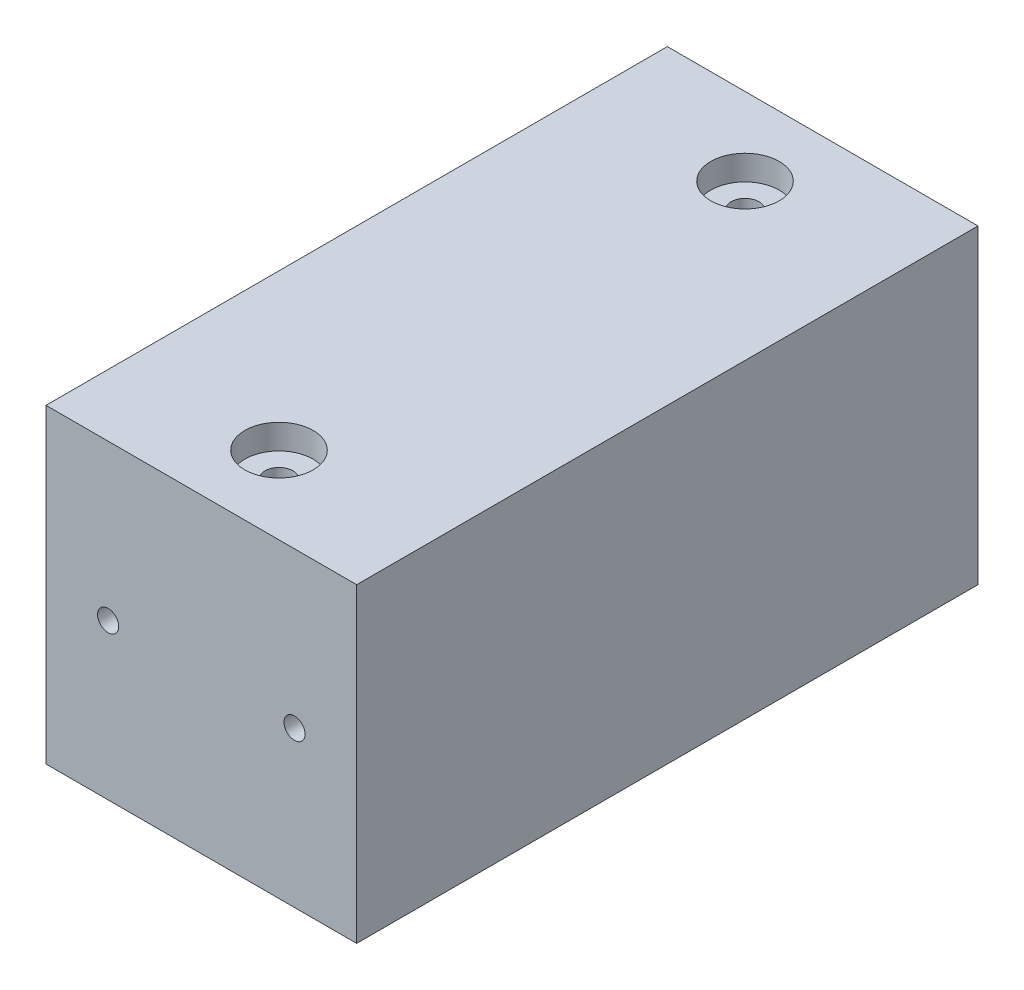
ISO-10303-21;
HEADER;
FILE_DESCRIPTION(('STEP AP214'),'2;1');
FILE_NAME('part.step','',(''),(''),'','','');
FILE_SCHEMA(('AUTOMOTIVE_DESIGN { 1 0 10303 214 1 1 1 1 }'));
ENDSEC;
DATA;
#1=APPLICATION_CONTEXT('core data for automotive mechanical design processes');
#2=APPLICATION_PROTOCOL_DEFINITION('international standard','automotive_design',2000,#1);
#3=PRODUCT_CONTEXT('',#1,'mechanical');
#4=PRODUCT('Part','Part','',(#3));
#5=PRODUCT_RELATED_PRODUCT_CATEGORY('part','',(#4));
#6=PRODUCT_DEFINITION_FORMATION('','',#4);
#7=PRODUCT_DEFINITION_CONTEXT('part definition',#1,'design');
#8=PRODUCT_DEFINITION('design','',#6,#7);
#9=PRODUCT_DEFINITION_SHAPE('','',#8);
#10=(LENGTH_UNIT() NAMED_UNIT(*) SI_UNIT(.MILLI.,.METRE.));
#11=(NAMED_UNIT(*) PLANE_ANGLE_UNIT() SI_UNIT($,.RADIAN.));
#12=(NAMED_UNIT(*) SI_UNIT($,.STERADIAN.) SOLID_ANGLE_UNIT());
#13=UNCERTAINTY_MEASURE_WITH_UNIT(LENGTH_MEASURE(1.E-05),#10,'distance_accuracy_value','');
#14=(GEOMETRIC_REPRESENTATION_CONTEXT(3) GLOBAL_UNCERTAINTY_ASSIGNED_CONTEXT((#13)) GLOBAL_UNIT_ASSIGNED_CONTEXT((#10,
#11,#12)) REPRESENTATION_CONTEXT('',''));
#15=CARTESIAN_POINT('',(0.,0.,0.));
#16=DIRECTION('',(0.,0.,1.));
#17=DIRECTION('',(1.,0.,0.));
#18=AXIS2_PLACEMENT_3D('',#15,#16,#17);
#19=CARTESIAN_POINT('',(-50.,-50.,200.));
#20=DIRECTION('',(1.,0.,0.));
#21=DIRECTION('',(0.,1.,0.));
#22=AXIS2_PLACEMENT_3D('',#19,#20,#21);
#23=PLANE('',#22);
#24=DIRECTION('',(0.,-1.,0.));
#25=VECTOR('',#24,1.);
#26=CARTESIAN_POINT('',(-50.,-50.,0.));
#27=LINE('',#26,#25);
#28=CARTESIAN_POINT('',(-50.,50.,0.));
#29=VERTEX_POINT('',#28);
#30=CARTESIAN_POINT('',(-50.,-50.,0.));
#31=VERTEX_POINT('',#30);
#32=EDGE_CURVE('E162',#29,#31,#27,.T.);
#33=ORIENTED_EDGE('',*,*,#32,.T.);
#34=DIRECTION('',(0.,0.,-1.));
#35=VECTOR('',#34,1.);
#36=CARTESIAN_POINT('',(-50.,-50.,200.));
#37=LINE('',#36,#35);
#38=CARTESIAN_POINT('',(-50.,-50.,200.));
#39=VERTEX_POINT('',#38);
#40=EDGE_CURVE('E13',#39,#31,#37,.T.);
#41=ORIENTED_EDGE('',*,*,#40,.F.);
#42=DIRECTION('',(0.,-1.,0.));
#43=VECTOR('',#42,1.);
#44=CARTESIAN_POINT('',(-50.,-50.,200.));
#45=LINE('',#44,#43);
#46=CARTESIAN_POINT('',(-50.,50.,200.));
#47=VERTEX_POINT('',#46);
#48=EDGE_CURVE('E163',#47,#39,#45,.T.);
#49=ORIENTED_EDGE('',*,*,#48,.F.);
#50=DIRECTION('',(0.,0.,-1.));
#51=VECTOR('',#50,1.);
#52=CARTESIAN_POINT('',(-50.,50.,200.));
#53=LINE('',#52,#51);
#54=EDGE_CURVE('E169',#47,#29,#53,.T.);
#55=ORIENTED_EDGE('',*,*,#54,.T.);
#56=EDGE_LOOP('',(#33,#41,#49,#55));
#57=FACE_BOUND('',#56,.T.);
#58=ADVANCED_FACE('F49',(#57),#23,.F.);
#59=CARTESIAN_POINT('',(50.,-50.,200.));
#60=DIRECTION('',(0.,1.,0.));
#61=DIRECTION('',(-1.,0.,0.));
#62=AXIS2_PLACEMENT_3D('',#59,#60,#61);
#63=PLANE('',#62);
#64=CARTESIAN_POINT('',(0.,-50.,175.));
#65=DIRECTION('',(0.,-1.,0.));
#66=DIRECTION('',(0.,0.,-1.));
#67=AXIS2_PLACEMENT_3D('',#64,#65,#66);
#68=CIRCLE('',#67,7.5);
#69=CARTESIAN_POINT('',(0.,-50.,167.5));
#70=VERTEX_POINT('',#69);
#71=EDGE_CURVE('E212',#70,#70,#68,.T.);
#72=ORIENTED_EDGE('',*,*,#71,.F.);
#73=EDGE_LOOP('',(#72));
#74=FACE_BOUND('',#73,.T.);
#75=CARTESIAN_POINT('',(0.,-50.,25.));
#76=DIRECTION('',(0.,-1.,0.));
#77=DIRECTION('',(0.,0.,-1.));
#78=AXIS2_PLACEMENT_3D('',#75,#76,#77);
#79=CIRCLE('',#78,7.5);
#80=CARTESIAN_POINT('',(0.,-50.,17.5));
#81=VERTEX_POINT('',#80);
#82=EDGE_CURVE('E215',#81,#81,#79,.T.);
#83=ORIENTED_EDGE('',*,*,#82,.F.);
#84=EDGE_LOOP('',(#83));
#85=FACE_BOUND('',#84,.T.);
#86=DIRECTION('',(1.,0.,0.));
#87=VECTOR('',#86,1.);
#88=CARTESIAN_POINT('',(50.,-50.,0.));
#89=LINE('',#88,#87);
#90=CARTESIAN_POINT('',(50.,-50.,0.));
#91=VERTEX_POINT('',#90);
#92=EDGE_CURVE('E172',#31,#91,#89,.T.);
#93=ORIENTED_EDGE('',*,*,#92,.T.);
#94=DIRECTION('',(0.,0.,-1.));
#95=VECTOR('',#94,1.);
#96=CARTESIAN_POINT('',(50.,-50.,200.));
#97=LINE('',#96,#95);
#98=CARTESIAN_POINT('',(50.,-50.,200.));
#99=VERTEX_POINT('',#98);
#100=EDGE_CURVE('E57',#99,#91,#97,.T.);
#101=ORIENTED_EDGE('',*,*,#100,.F.);
#102=DIRECTION('',(1.,0.,0.));
#103=VECTOR('',#102,1.);
#104=CARTESIAN_POINT('',(50.,-50.,200.));
#105=LINE('',#104,#103);
#106=EDGE_CURVE('E96',#39,#99,#105,.T.);
#107=ORIENTED_EDGE('',*,*,#106,.F.);
#108=ORIENTED_EDGE('',*,*,#40,.T.);
#109=EDGE_LOOP('',(#93,#101,#107,#108));
#110=FACE_BOUND('',#109,.T.);
#111=ADVANCED_FACE('F197',(#74,#85,#110),#63,.F.);
#112=CARTESIAN_POINT('',(50.,-50.,200.));
#113=DIRECTION('',(-1.,0.,0.));
#114=DIRECTION('',(0.,-1.,0.));
#115=AXIS2_PLACEMENT_3D('',#112,#113,#114);
#116=PLANE('',#115);
#117=DIRECTION('',(0.,1.,0.));
#118=VECTOR('',#117,1.);
#119=CARTESIAN_POINT('',(50.,-50.,0.));
#120=LINE('',#119,#118);
#121=CARTESIAN_POINT('',(50.,50.,0.));
#122=VERTEX_POINT('',#121);
#123=EDGE_CURVE('E83',#91,#122,#120,.T.);
#124=ORIENTED_EDGE('',*,*,#123,.T.);
#125=DIRECTION('',(0.,0.,-1.));
#126=VECTOR('',#125,1.);
#127=CARTESIAN_POINT('',(50.,50.,200.));
#128=LINE('',#127,#126);
#129=CARTESIAN_POINT('',(50.,50.,200.));
#130=VERTEX_POINT('',#129);
#131=EDGE_CURVE('E177',#130,#122,#128,.T.);
#132=ORIENTED_EDGE('',*,*,#131,.F.);
#133=DIRECTION('',(0.,1.,0.));
#134=VECTOR('',#133,1.);
#135=CARTESIAN_POINT('',(50.,-50.,200.));
#136=LINE('',#135,#134);
#137=EDGE_CURVE('E166',#99,#130,#136,.T.);
#138=ORIENTED_EDGE('',*,*,#137,.F.);
#139=ORIENTED_EDGE('',*,*,#100,.T.);
#140=EDGE_LOOP('',(#124,#132,#138,#139));
#141=FACE_BOUND('',#140,.T.);
#142=ADVANCED_FACE('F179',(#141),#116,.F.);
#143=CARTESIAN_POINT('',(50.,50.,200.));
#144=DIRECTION('',(0.,-1.,0.));
#145=DIRECTION('',(1.,0.,0.));
#146=AXIS2_PLACEMENT_3D('',#143,#144,#145);
#147=PLANE('',#146);
#148=CARTESIAN_POINT('',(0.,50.,25.));
#149=DIRECTION('',(0.,1.,0.));
#150=DIRECTION('',(0.,0.,1.));
#151=AXIS2_PLACEMENT_3D('',#148,#149,#150);
#152=CIRCLE('',#151,11.);
#153=CARTESIAN_POINT('',(0.,50.,36.));
#154=VERTEX_POINT('',#153);
#155=EDGE_CURVE('E144',#154,#154,#152,.T.);
#156=ORIENTED_EDGE('',*,*,#155,.F.);
#157=EDGE_LOOP('',(#156));
#158=FACE_BOUND('',#157,.T.);
#159=CARTESIAN_POINT('',(0.,50.,175.));
#160=DIRECTION('',(0.,1.,0.));
#161=DIRECTION('',(0.,0.,1.));
#162=AXIS2_PLACEMENT_3D('',#159,#160,#161);
#163=CIRCLE('',#162,11.);
#164=CARTESIAN_POINT('',(0.,50.,186.));
#165=VERTEX_POINT('',#164);
#166=EDGE_CURVE('E153',#165,#165,#163,.T.);
#167=ORIENTED_EDGE('',*,*,#166,.F.);
#168=EDGE_LOOP('',(#167));
#169=FACE_BOUND('',#168,.T.);
#170=DIRECTION('',(-1.,0.,0.));
#171=VECTOR('',#170,1.);
#172=CARTESIAN_POINT('',(50.,50.,0.));
#173=LINE('',#172,#171);
#174=EDGE_CURVE('E89',#122,#29,#173,.T.);
#175=ORIENTED_EDGE('',*,*,#174,.T.);
#176=ORIENTED_EDGE('',*,*,#54,.F.);
#177=DIRECTION('',(-1.,0.,0.));
#178=VECTOR('',#177,1.);
#179=CARTESIAN_POINT('',(50.,50.,200.));
#180=LINE('',#179,#178);
#181=EDGE_CURVE('E65',#130,#47,#180,.T.);
#182=ORIENTED_EDGE('',*,*,#181,.F.);
#183=ORIENTED_EDGE('',*,*,#131,.T.);
#184=EDGE_LOOP('',(#175,#176,#182,#183));
#185=FACE_BOUND('',#184,.T.);
#186=ADVANCED_FACE('F186',(#158,#169,#185),#147,.F.);
#187=CARTESIAN_POINT('',(0.,0.,200.));
#188=DIRECTION('',(0.,0.,1.));
#189=DIRECTION('',(1.,0.,0.));
#190=AXIS2_PLACEMENT_3D('',#187,#188,#189);
#191=PLANE('',#190);
#192=CARTESIAN_POINT('',(30.,0.,200.));
#193=DIRECTION('',(0.,0.,1.));
#194=DIRECTION('',(1.,0.,0.));
#195=AXIS2_PLACEMENT_3D('',#192,#193,#194);
#196=CIRCLE('',#195,3.4);
#197=CARTESIAN_POINT('',(33.4,0.,200.));
#198=VERTEX_POINT('',#197);
#199=EDGE_CURVE('E120',#198,#198,#196,.T.);
#200=ORIENTED_EDGE('',*,*,#199,.F.);
#201=EDGE_LOOP('',(#200));
#202=FACE_BOUND('',#201,.T.);
#203=CARTESIAN_POINT('',(-30.,0.,200.));
#204=DIRECTION('',(0.,0.,1.));
#205=DIRECTION('',(1.,0.,0.));
#206=AXIS2_PLACEMENT_3D('',#203,#204,#205);
#207=CIRCLE('',#206,3.4);
#208=CARTESIAN_POINT('',(-26.6,0.,200.));
#209=VERTEX_POINT('',#208);
#210=EDGE_CURVE('E119',#209,#209,#207,.T.);
#211=ORIENTED_EDGE('',*,*,#210,.F.);
#212=EDGE_LOOP('',(#211));
#213=FACE_BOUND('',#212,.T.);
#214=ORIENTED_EDGE('',*,*,#48,.T.);
#215=ORIENTED_EDGE('',*,*,#106,.T.);
#216=ORIENTED_EDGE('',*,*,#137,.T.);
#217=ORIENTED_EDGE('',*,*,#181,.T.);
#218=EDGE_LOOP('',(#214,#215,#216,#217));
#219=FACE_BOUND('',#218,.T.);
#220=ADVANCED_FACE('F188',(#202,#213,#219),#191,.T.);
#221=CARTESIAN_POINT('',(0.,0.,0.));
#222=DIRECTION('',(0.,0.,1.));
#223=DIRECTION('',(1.,0.,0.));
#224=AXIS2_PLACEMENT_3D('',#221,#222,#223);
#225=PLANE('',#224);
#226=CARTESIAN_POINT('',(-30.,0.,0.));
#227=DIRECTION('',(0.,0.,-1.));
#228=DIRECTION('',(-1.,0.,0.));
#229=AXIS2_PLACEMENT_3D('',#226,#227,#228);
#230=CIRCLE('',#229,3.4);
#231=CARTESIAN_POINT('',(-33.4,0.,0.));
#232=VERTEX_POINT('',#231);
#233=EDGE_CURVE('E132',#232,#232,#230,.T.);
#234=ORIENTED_EDGE('',*,*,#233,.F.);
#235=EDGE_LOOP('',(#234));
#236=FACE_BOUND('',#235,.T.);
#237=CARTESIAN_POINT('',(30.,0.,0.));
#238=DIRECTION('',(0.,0.,-1.));
#239=DIRECTION('',(-1.,0.,0.));
#240=AXIS2_PLACEMENT_3D('',#237,#238,#239);
#241=CIRCLE('',#240,3.4);
#242=CARTESIAN_POINT('',(26.6,0.,0.));
#243=VERTEX_POINT('',#242);
#244=EDGE_CURVE('E138',#243,#243,#241,.T.);
#245=ORIENTED_EDGE('',*,*,#244,.F.);
#246=EDGE_LOOP('',(#245));
#247=FACE_BOUND('',#246,.T.);
#248=ORIENTED_EDGE('',*,*,#32,.F.);
#249=ORIENTED_EDGE('',*,*,#174,.F.);
#250=ORIENTED_EDGE('',*,*,#123,.F.);
#251=ORIENTED_EDGE('',*,*,#92,.F.);
#252=EDGE_LOOP('',(#248,#249,#250,#251));
#253=FACE_BOUND('',#252,.T.);
#254=ADVANCED_FACE('F182',(#236,#247,#253),#225,.F.);
#255=CARTESIAN_POINT('',(0.,50.,175.));
#256=DIRECTION('',(0.,1.,0.));
#257=DIRECTION('',(0.,0.,1.));
#258=AXIS2_PLACEMENT_3D('',#255,#256,#257);
#259=CYLINDRICAL_SURFACE('',#258,4.49999999999999);
#260=CARTESIAN_POINT('',(0.,-42.,175.));
#261=DIRECTION('',(0.,-1.,0.));
#262=DIRECTION('',(0.,0.,-1.));
#263=AXIS2_PLACEMENT_3D('',#260,#261,#262);
#264=CIRCLE('',#263,4.50000000000001);
#265=CARTESIAN_POINT('',(0.,-42.,170.5));
#266=VERTEX_POINT('',#265);
#267=EDGE_CURVE('E218',#266,#266,#264,.T.);
#268=ORIENTED_EDGE('',*,*,#267,.T.);
#269=EDGE_LOOP('',(#268));
#270=FACE_BOUND('',#269,.T.);
#271=CARTESIAN_POINT('',(0.,42.,175.));
#272=DIRECTION('',(0.,1.,0.));
#273=DIRECTION('',(0.,0.,1.));
#274=AXIS2_PLACEMENT_3D('',#271,#272,#273);
#275=CIRCLE('',#274,4.50000000000001);
#276=CARTESIAN_POINT('',(0.,42.,179.5));
#277=VERTEX_POINT('',#276);
#278=EDGE_CURVE('E159',#277,#277,#275,.T.);
#279=ORIENTED_EDGE('',*,*,#278,.T.);
#280=EDGE_LOOP('',(#279));
#281=FACE_BOUND('',#280,.T.);
#282=ADVANCED_FACE('F292',(#270,#281),#259,.F.);
#283=CARTESIAN_POINT('',(4.50000000000001,42.,175.));
#284=DIRECTION('',(0.,-1.,0.));
#285=DIRECTION('',(0.,0.,-1.));
#286=AXIS2_PLACEMENT_3D('',#283,#284,#285);
#287=PLANE('',#286);
#288=ORIENTED_EDGE('',*,*,#278,.F.);
#289=EDGE_LOOP('',(#288));
#290=FACE_BOUND('',#289,.T.);
#291=CARTESIAN_POINT('',(0.,42.,175.));
#292=DIRECTION('',(0.,1.,0.));
#293=DIRECTION('',(0.,0.,1.));
#294=AXIS2_PLACEMENT_3D('',#291,#292,#293);
#295=CIRCLE('',#294,11.);
#296=CARTESIAN_POINT('',(0.,42.,186.));
#297=VERTEX_POINT('',#296);
#298=EDGE_CURVE('E156',#297,#297,#295,.T.);
#299=ORIENTED_EDGE('',*,*,#298,.T.);
#300=EDGE_LOOP('',(#299));
#301=FACE_BOUND('',#300,.T.);
#302=ADVANCED_FACE('F288',(#290,#301),#287,.F.);
#303=CARTESIAN_POINT('',(0.,50.,175.));
#304=DIRECTION('',(0.,1.,0.));
#305=DIRECTION('',(0.,0.,1.));
#306=AXIS2_PLACEMENT_3D('',#303,#304,#305);
#307=CYLINDRICAL_SURFACE('',#306,11.);
#308=ORIENTED_EDGE('',*,*,#298,.F.);
#309=EDGE_LOOP('',(#308));
#310=FACE_BOUND('',#309,.T.);
#311=ORIENTED_EDGE('',*,*,#166,.T.);
#312=EDGE_LOOP('',(#311));
#313=FACE_BOUND('',#312,.T.);
#314=ADVANCED_FACE('F285',(#310,#313),#307,.F.);
#315=CARTESIAN_POINT('',(0.,50.,25.));
#316=DIRECTION('',(0.,1.,0.));
#317=DIRECTION('',(0.,0.,1.));
#318=AXIS2_PLACEMENT_3D('',#315,#316,#317);
#319=CYLINDRICAL_SURFACE('',#318,4.49999999999999);
#320=CARTESIAN_POINT('',(0.,-42.,25.));
#321=DIRECTION('',(0.,-1.,0.));
#322=DIRECTION('',(0.,0.,-1.));
#323=AXIS2_PLACEMENT_3D('',#320,#321,#322);
#324=CIRCLE('',#323,4.50000000000001);
#325=CARTESIAN_POINT('',(0.,-42.,20.5));
#326=VERTEX_POINT('',#325);
#327=EDGE_CURVE('E126',#326,#326,#324,.T.);
#328=ORIENTED_EDGE('',*,*,#327,.T.);
#329=EDGE_LOOP('',(#328));
#330=FACE_BOUND('',#329,.T.);
#331=CARTESIAN_POINT('',(0.,42.,25.));
#332=DIRECTION('',(0.,1.,0.));
#333=DIRECTION('',(0.,0.,1.));
#334=AXIS2_PLACEMENT_3D('',#331,#332,#333);
#335=CIRCLE('',#334,4.50000000000001);
#336=CARTESIAN_POINT('',(0.,42.,29.5));
#337=VERTEX_POINT('',#336);
#338=EDGE_CURVE('E150',#337,#337,#335,.T.);
#339=ORIENTED_EDGE('',*,*,#338,.T.);
#340=EDGE_LOOP('',(#339));
#341=FACE_BOUND('',#340,.T.);
#342=ADVANCED_FACE('F229',(#330,#341),#319,.F.);
#343=CARTESIAN_POINT('',(4.50000000000001,42.,25.));
#344=DIRECTION('',(0.,-1.,0.));
#345=DIRECTION('',(0.,0.,-1.));
#346=AXIS2_PLACEMENT_3D('',#343,#344,#345);
#347=PLANE('',#346);
#348=ORIENTED_EDGE('',*,*,#338,.F.);
#349=EDGE_LOOP('',(#348));
#350=FACE_BOUND('',#349,.T.);
#351=CARTESIAN_POINT('',(0.,42.,25.));
#352=DIRECTION('',(0.,1.,0.));
#353=DIRECTION('',(0.,0.,1.));
#354=AXIS2_PLACEMENT_3D('',#351,#352,#353);
#355=CIRCLE('',#354,11.);
#356=CARTESIAN_POINT('',(0.,42.,36.));
#357=VERTEX_POINT('',#356);
#358=EDGE_CURVE('E147',#357,#357,#355,.T.);
#359=ORIENTED_EDGE('',*,*,#358,.T.);
#360=EDGE_LOOP('',(#359));
#361=FACE_BOUND('',#360,.T.);
#362=ADVANCED_FACE('F278',(#350,#361),#347,.F.);
#363=CARTESIAN_POINT('',(0.,50.,25.));
#364=DIRECTION('',(0.,1.,0.));
#365=DIRECTION('',(0.,0.,1.));
#366=AXIS2_PLACEMENT_3D('',#363,#364,#365);
#367=CYLINDRICAL_SURFACE('',#366,11.);
#368=ORIENTED_EDGE('',*,*,#358,.F.);
#369=EDGE_LOOP('',(#368));
#370=FACE_BOUND('',#369,.T.);
#371=ORIENTED_EDGE('',*,*,#155,.T.);
#372=EDGE_LOOP('',(#371));
#373=FACE_BOUND('',#372,.T.);
#374=ADVANCED_FACE('F274',(#370,#373),#367,.F.);
#375=CARTESIAN_POINT('',(30.,0.,30.));
#376=DIRECTION('',(0.,0.,-1.));
#377=DIRECTION('',(-1.,0.,0.));
#378=AXIS2_PLACEMENT_3D('',#375,#376,#377);
#379=CONICAL_SURFACE('',#378,3.39999999999999,1.02974425867665);
#380=CARTESIAN_POINT('',(30.,0.,32.0429261046937));
#381=VERTEX_POINT('',#380);
#382=VERTEX_LOOP('',#381);
#383=FACE_BOUND('',#382,.T.);
#384=CARTESIAN_POINT('',(30.,0.,30.));
#385=DIRECTION('',(0.,0.,-1.));
#386=DIRECTION('',(-1.,0.,0.));
#387=AXIS2_PLACEMENT_3D('',#384,#385,#386);
#388=CIRCLE('',#387,3.39999999999999);
#389=CARTESIAN_POINT('',(26.6,0.,30.));
#390=VERTEX_POINT('',#389);
#391=EDGE_CURVE('E141',#390,#390,#388,.T.);
#392=ORIENTED_EDGE('',*,*,#391,.T.);
#393=EDGE_LOOP('',(#392));
#394=FACE_BOUND('',#393,.T.);
#395=ADVANCED_FACE('F270',(#383,#394),#379,.F.);
#396=CARTESIAN_POINT('',(30.,0.,0.));
#397=DIRECTION('',(0.,0.,-1.));
#398=DIRECTION('',(-1.,0.,0.));
#399=AXIS2_PLACEMENT_3D('',#396,#397,#398);
#400=CYLINDRICAL_SURFACE('',#399,3.4);
#401=ORIENTED_EDGE('',*,*,#391,.F.);
#402=EDGE_LOOP('',(#401));
#403=FACE_BOUND('',#402,.T.);
#404=ORIENTED_EDGE('',*,*,#244,.T.);
#405=EDGE_LOOP('',(#404));
#406=FACE_BOUND('',#405,.T.);
#407=ADVANCED_FACE('F266',(#403,#406),#400,.F.);
#408=CARTESIAN_POINT('',(-30.,0.,30.));
#409=DIRECTION('',(0.,0.,-1.));
#410=DIRECTION('',(-1.,0.,0.));
#411=AXIS2_PLACEMENT_3D('',#408,#409,#410);
#412=CONICAL_SURFACE('',#411,3.39999999999999,1.02974425867665);
#413=CARTESIAN_POINT('',(-30.,0.,32.0429261046937));
#414=VERTEX_POINT('',#413);
#415=VERTEX_LOOP('',#414);
#416=FACE_BOUND('',#415,.T.);
#417=CARTESIAN_POINT('',(-30.,0.,30.));
#418=DIRECTION('',(0.,0.,-1.));
#419=DIRECTION('',(-1.,0.,0.));
#420=AXIS2_PLACEMENT_3D('',#417,#418,#419);
#421=CIRCLE('',#420,3.39999999999999);
#422=CARTESIAN_POINT('',(-33.4,0.,30.));
#423=VERTEX_POINT('',#422);
#424=EDGE_CURVE('E135',#423,#423,#421,.T.);
#425=ORIENTED_EDGE('',*,*,#424,.T.);
#426=EDGE_LOOP('',(#425));
#427=FACE_BOUND('',#426,.T.);
#428=ADVANCED_FACE('F262',(#416,#427),#412,.F.);
#429=CARTESIAN_POINT('',(-30.,0.,0.));
#430=DIRECTION('',(0.,0.,-1.));
#431=DIRECTION('',(-1.,0.,0.));
#432=AXIS2_PLACEMENT_3D('',#429,#430,#431);
#433=CYLINDRICAL_SURFACE('',#432,3.4);
#434=ORIENTED_EDGE('',*,*,#424,.F.);
#435=EDGE_LOOP('',(#434));
#436=FACE_BOUND('',#435,.T.);
#437=ORIENTED_EDGE('',*,*,#233,.T.);
#438=EDGE_LOOP('',(#437));
#439=FACE_BOUND('',#438,.T.);
#440=ADVANCED_FACE('F258',(#436,#439),#433,.F.);
#441=CARTESIAN_POINT('',(-30.,0.,170.));
#442=DIRECTION('',(0.,0.,1.));
#443=DIRECTION('',(1.,0.,0.));
#444=AXIS2_PLACEMENT_3D('',#441,#442,#443);
#445=CONICAL_SURFACE('',#444,3.39999999999999,1.02974425867665);
#446=CARTESIAN_POINT('',(-30.,0.,167.957073895306));
#447=VERTEX_POINT('',#446);
#448=VERTEX_LOOP('',#447);
#449=FACE_BOUND('',#448,.T.);
#450=CARTESIAN_POINT('',(-30.,0.,170.));
#451=DIRECTION('',(0.,0.,1.));
#452=DIRECTION('',(1.,0.,0.));
#453=AXIS2_PLACEMENT_3D('',#450,#451,#452);
#454=CIRCLE('',#453,3.39999999999999);
#455=CARTESIAN_POINT('',(-26.6,0.,170.));
#456=VERTEX_POINT('',#455);
#457=EDGE_CURVE('E123',#456,#456,#454,.T.);
#458=ORIENTED_EDGE('',*,*,#457,.T.);
#459=EDGE_LOOP('',(#458));
#460=FACE_BOUND('',#459,.T.);
#461=ADVANCED_FACE('F254',(#449,#460),#445,.F.);
#462=CARTESIAN_POINT('',(-30.,0.,200.));
#463=DIRECTION('',(0.,0.,1.));
#464=DIRECTION('',(1.,0.,0.));
#465=AXIS2_PLACEMENT_3D('',#462,#463,#464);
#466=CYLINDRICAL_SURFACE('',#465,3.4);
#467=ORIENTED_EDGE('',*,*,#457,.F.);
#468=EDGE_LOOP('',(#467));
#469=FACE_BOUND('',#468,.T.);
#470=ORIENTED_EDGE('',*,*,#210,.T.);
#471=EDGE_LOOP('',(#470));
#472=FACE_BOUND('',#471,.T.);
#473=ADVANCED_FACE('F113',(#469,#472),#466,.F.);
#474=CARTESIAN_POINT('',(30.,0.,170.));
#475=DIRECTION('',(0.,0.,1.));
#476=DIRECTION('',(1.,0.,0.));
#477=AXIS2_PLACEMENT_3D('',#474,#475,#476);
#478=CONICAL_SURFACE('',#477,3.39999999999999,1.02974425867665);
#479=CARTESIAN_POINT('',(30.,0.,167.957073895306));
#480=VERTEX_POINT('',#479);
#481=VERTEX_LOOP('',#480);
#482=FACE_BOUND('',#481,.T.);
#483=CARTESIAN_POINT('',(30.,0.,170.));
#484=DIRECTION('',(0.,0.,1.));
#485=DIRECTION('',(1.,0.,0.));
#486=AXIS2_PLACEMENT_3D('',#483,#484,#485);
#487=CIRCLE('',#486,3.39999999999999);
#488=CARTESIAN_POINT('',(33.4,0.,170.));
#489=VERTEX_POINT('',#488);
#490=EDGE_CURVE('E117',#489,#489,#487,.T.);
#491=ORIENTED_EDGE('',*,*,#490,.T.);
#492=EDGE_LOOP('',(#491));
#493=FACE_BOUND('',#492,.T.);
#494=ADVANCED_FACE('F109',(#482,#493),#478,.F.);
#495=CARTESIAN_POINT('',(30.,0.,200.));
#496=DIRECTION('',(0.,0.,1.));
#497=DIRECTION('',(1.,0.,0.));
#498=AXIS2_PLACEMENT_3D('',#495,#496,#497);
#499=CYLINDRICAL_SURFACE('',#498,3.39999999999999);
#500=ORIENTED_EDGE('',*,*,#490,.F.);
#501=EDGE_LOOP('',(#500));
#502=FACE_BOUND('',#501,.T.);
#503=ORIENTED_EDGE('',*,*,#199,.T.);
#504=EDGE_LOOP('',(#503));
#505=FACE_BOUND('',#504,.T.);
#506=ADVANCED_FACE('F112',(#502,#505),#499,.F.);
#507=CARTESIAN_POINT('',(4.50000000000001,-42.,25.));
#508=DIRECTION('',(0.,1.,0.));
#509=DIRECTION('',(0.,0.,1.));
#510=AXIS2_PLACEMENT_3D('',#507,#508,#509);
#511=PLANE('',#510);
#512=ORIENTED_EDGE('',*,*,#327,.F.);
#513=EDGE_LOOP('',(#512));
#514=FACE_BOUND('',#513,.T.);
#515=CARTESIAN_POINT('',(0.,-42.,25.));
#516=DIRECTION('',(0.,-1.,0.));
#517=DIRECTION('',(0.,0.,-1.));
#518=AXIS2_PLACEMENT_3D('',#515,#516,#517);
#519=CIRCLE('',#518,7.5);
#520=CARTESIAN_POINT('',(0.,-42.,17.5));
#521=VERTEX_POINT('',#520);
#522=EDGE_CURVE('E217',#521,#521,#519,.T.);
#523=ORIENTED_EDGE('',*,*,#522,.T.);
#524=EDGE_LOOP('',(#523));
#525=FACE_BOUND('',#524,.T.);
#526=ADVANCED_FACE('F232',(#514,#525),#511,.F.);
#527=CARTESIAN_POINT('',(0.,-50.,25.));
#528=DIRECTION('',(0.,-1.,0.));
#529=DIRECTION('',(0.,0.,-1.));
#530=AXIS2_PLACEMENT_3D('',#527,#528,#529);
#531=CYLINDRICAL_SURFACE('',#530,7.5);
#532=ORIENTED_EDGE('',*,*,#522,.F.);
#533=EDGE_LOOP('',(#532));
#534=FACE_BOUND('',#533,.T.);
#535=ORIENTED_EDGE('',*,*,#82,.T.);
#536=EDGE_LOOP('',(#535));
#537=FACE_BOUND('',#536,.T.);
#538=ADVANCED_FACE('F235',(#534,#537),#531,.F.);
#539=CARTESIAN_POINT('',(4.50000000000001,-42.,175.));
#540=DIRECTION('',(0.,1.,0.));
#541=DIRECTION('',(0.,0.,1.));
#542=AXIS2_PLACEMENT_3D('',#539,#540,#541);
#543=PLANE('',#542);
#544=ORIENTED_EDGE('',*,*,#267,.F.);
#545=EDGE_LOOP('',(#544));
#546=FACE_BOUND('',#545,.T.);
#547=CARTESIAN_POINT('',(0.,-42.,175.));
#548=DIRECTION('',(0.,-1.,0.));
#549=DIRECTION('',(0.,0.,-1.));
#550=AXIS2_PLACEMENT_3D('',#547,#548,#549);
#551=CIRCLE('',#550,7.5);
#552=CARTESIAN_POINT('',(0.,-42.,167.5));
#553=VERTEX_POINT('',#552);
#554=EDGE_CURVE('E223',#553,#553,#551,.T.);
#555=ORIENTED_EDGE('',*,*,#554,.T.);
#556=EDGE_LOOP('',(#555));
#557=FACE_BOUND('',#556,.T.);
#558=ADVANCED_FACE('F240',(#546,#557),#543,.F.);
#559=CARTESIAN_POINT('',(0.,-50.,175.));
#560=DIRECTION('',(0.,-1.,0.));
#561=DIRECTION('',(0.,0.,-1.));
#562=AXIS2_PLACEMENT_3D('',#559,#560,#561);
#563=CYLINDRICAL_SURFACE('',#562,7.5);
#564=ORIENTED_EDGE('',*,*,#554,.F.);
#565=EDGE_LOOP('',(#564));
#566=FACE_BOUND('',#565,.T.);
#567=ORIENTED_EDGE('',*,*,#71,.T.);
#568=EDGE_LOOP('',(#567));
#569=FACE_BOUND('',#568,.T.);
#570=ADVANCED_FACE('F245',(#566,#569),#563,.F.);
#571=CLOSED_SHELL('',(#58,#111,#142,#186,#220,#254,#282,#302,#314,#342,#362,#374,#395,#407,#428,
#440,#461,#473,#494,#506,#526,#538,#558,#570));
#572=MANIFOLD_SOLID_BREP('B2',#571);
#573=ADVANCED_BREP_SHAPE_REPRESENTATION('',(#18,#572),#14);
#574=SHAPE_DEFINITION_REPRESENTATION(#9,#573);
ENDSEC;
END-ISO-10303-21;
